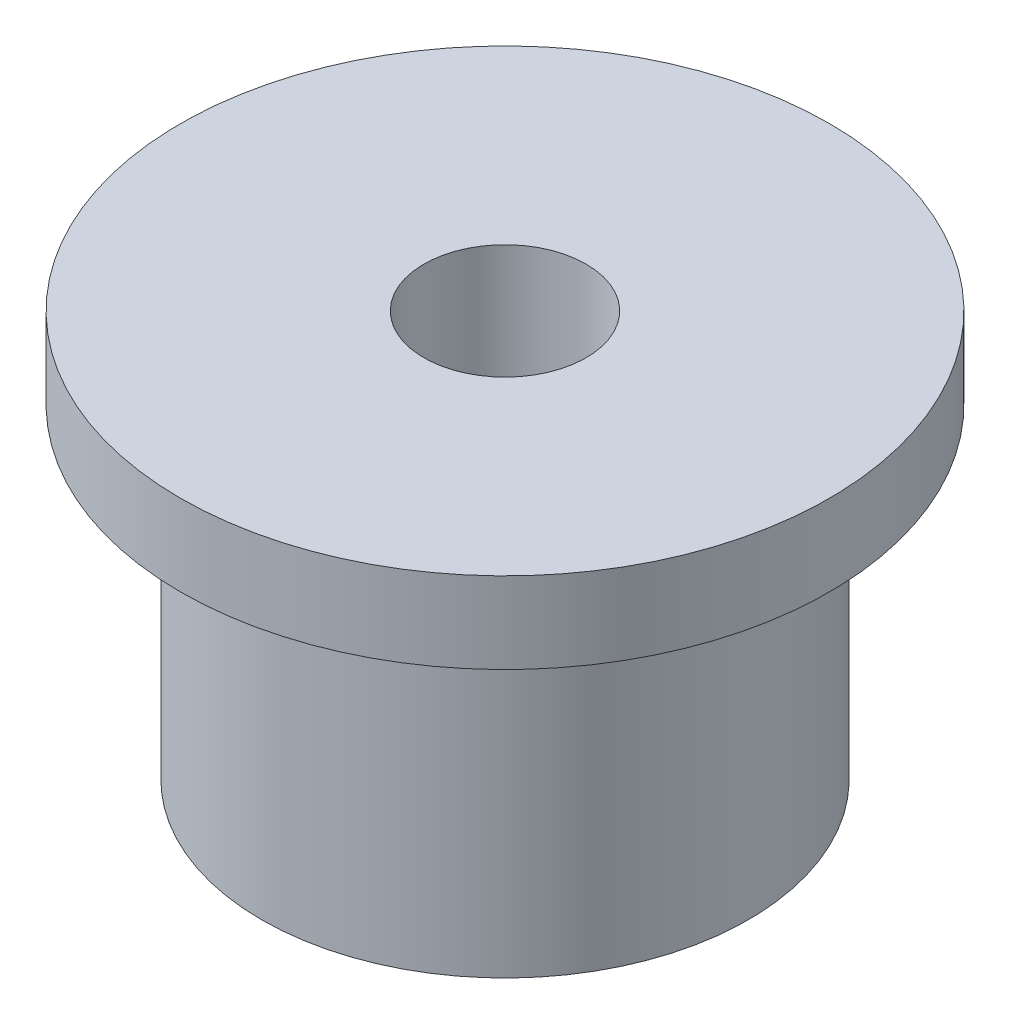
ISO-10303-21;
HEADER;
FILE_DESCRIPTION(('STEP AP214'),'2;1');
FILE_NAME('part.step','',(''),(''),'','','');
FILE_SCHEMA(('AUTOMOTIVE_DESIGN { 1 0 10303 214 1 1 1 1 }'));
ENDSEC;
DATA;
#1=APPLICATION_CONTEXT('core data for automotive mechanical design processes');
#2=APPLICATION_PROTOCOL_DEFINITION('international standard','automotive_design',2000,#1);
#3=PRODUCT_CONTEXT('',#1,'mechanical');
#4=PRODUCT('Part','Part','',(#3));
#5=PRODUCT_RELATED_PRODUCT_CATEGORY('part','',(#4));
#6=PRODUCT_DEFINITION_FORMATION('','',#4);
#7=PRODUCT_DEFINITION_CONTEXT('part definition',#1,'design');
#8=PRODUCT_DEFINITION('design','',#6,#7);
#9=PRODUCT_DEFINITION_SHAPE('','',#8);
#10=(LENGTH_UNIT() NAMED_UNIT(*) SI_UNIT(.MILLI.,.METRE.));
#11=(NAMED_UNIT(*) PLANE_ANGLE_UNIT() SI_UNIT($,.RADIAN.));
#12=(NAMED_UNIT(*) SI_UNIT($,.STERADIAN.) SOLID_ANGLE_UNIT());
#13=UNCERTAINTY_MEASURE_WITH_UNIT(LENGTH_MEASURE(1.E-05),#10,'distance_accuracy_value','');
#14=(GEOMETRIC_REPRESENTATION_CONTEXT(3) GLOBAL_UNCERTAINTY_ASSIGNED_CONTEXT((#13)) GLOBAL_UNIT_ASSIGNED_CONTEXT((#10,
#11,#12)) REPRESENTATION_CONTEXT('',''));
#15=CARTESIAN_POINT('',(0.,0.,0.));
#16=DIRECTION('',(0.,0.,1.));
#17=DIRECTION('',(1.,0.,0.));
#18=AXIS2_PLACEMENT_3D('',#15,#16,#17);
#19=CARTESIAN_POINT('',(0.,25.,0.));
#20=DIRECTION('',(0.,-1.,0.));
#21=DIRECTION('',(0.,0.,-1.));
#22=AXIS2_PLACEMENT_3D('',#19,#20,#21);
#23=CYLINDRICAL_SURFACE('',#22,100.);
#24=CARTESIAN_POINT('',(0.,25.,0.));
#25=DIRECTION('',(0.,1.,0.));
#26=DIRECTION('',(0.,0.,1.));
#27=AXIS2_PLACEMENT_3D('',#24,#25,#26);
#28=CIRCLE('',#27,100.);
#29=CARTESIAN_POINT('',(0.,25.,100.));
#30=VERTEX_POINT('',#29);
#31=EDGE_CURVE('E42',#30,#30,#28,.T.);
#32=ORIENTED_EDGE('',*,*,#31,.F.);
#33=EDGE_LOOP('',(#32));
#34=FACE_BOUND('',#33,.T.);
#35=CARTESIAN_POINT('',(0.,0.,0.));
#36=DIRECTION('',(0.,1.,0.));
#37=DIRECTION('',(0.,0.,1.));
#38=AXIS2_PLACEMENT_3D('',#35,#36,#37);
#39=CIRCLE('',#38,100.);
#40=CARTESIAN_POINT('',(0.,0.,100.));
#41=VERTEX_POINT('',#40);
#42=EDGE_CURVE('E38',#41,#41,#39,.T.);
#43=ORIENTED_EDGE('',*,*,#42,.T.);
#44=EDGE_LOOP('',(#43));
#45=FACE_BOUND('',#44,.T.);
#46=ADVANCED_FACE('F35',(#34,#45),#23,.T.);
#47=CARTESIAN_POINT('',(0.,25.,0.));
#48=DIRECTION('',(0.,1.,0.));
#49=DIRECTION('',(0.,0.,1.));
#50=AXIS2_PLACEMENT_3D('',#47,#48,#49);
#51=PLANE('',#50);
#52=CARTESIAN_POINT('',(0.,25.,0.));
#53=DIRECTION('',(0.,-1.,0.));
#54=DIRECTION('',(0.,0.,-1.));
#55=AXIS2_PLACEMENT_3D('',#52,#53,#54);
#56=CIRCLE('',#55,25.);
#57=CARTESIAN_POINT('',(0.,25.,-25.));
#58=VERTEX_POINT('',#57);
#59=EDGE_CURVE('E51',#58,#58,#56,.T.);
#60=ORIENTED_EDGE('',*,*,#59,.T.);
#61=EDGE_LOOP('',(#60));
#62=FACE_BOUND('',#61,.T.);
#63=ORIENTED_EDGE('',*,*,#31,.T.);
#64=EDGE_LOOP('',(#63));
#65=FACE_BOUND('',#64,.T.);
#66=ADVANCED_FACE('F58',(#62,#65),#51,.T.);
#67=CARTESIAN_POINT('',(0.,0.,0.));
#68=DIRECTION('',(0.,1.,0.));
#69=DIRECTION('',(0.,0.,1.));
#70=AXIS2_PLACEMENT_3D('',#67,#68,#69);
#71=PLANE('',#70);
#72=CARTESIAN_POINT('',(0.,0.,0.));
#73=DIRECTION('',(0.,-1.,0.));
#74=DIRECTION('',(0.,0.,-1.));
#75=AXIS2_PLACEMENT_3D('',#72,#73,#74);
#76=CIRCLE('',#75,75.);
#77=CARTESIAN_POINT('',(0.,0.,-75.));
#78=VERTEX_POINT('',#77);
#79=EDGE_CURVE('E10',#78,#78,#76,.T.);
#80=ORIENTED_EDGE('',*,*,#79,.F.);
#81=EDGE_LOOP('',(#80));
#82=FACE_BOUND('',#81,.T.);
#83=ORIENTED_EDGE('',*,*,#42,.F.);
#84=EDGE_LOOP('',(#83));
#85=FACE_BOUND('',#84,.T.);
#86=ADVANCED_FACE('F75',(#82,#85),#71,.F.);
#87=CARTESIAN_POINT('',(0.,-100.,0.));
#88=DIRECTION('',(0.,1.,0.));
#89=DIRECTION('',(0.,0.,1.));
#90=AXIS2_PLACEMENT_3D('',#87,#88,#89);
#91=CYLINDRICAL_SURFACE('',#90,75.);
#92=CARTESIAN_POINT('',(0.,-100.,0.));
#93=DIRECTION('',(0.,-1.,0.));
#94=DIRECTION('',(0.,0.,-1.));
#95=AXIS2_PLACEMENT_3D('',#92,#93,#94);
#96=CIRCLE('',#95,75.);
#97=CARTESIAN_POINT('',(0.,-100.,-75.));
#98=VERTEX_POINT('',#97);
#99=EDGE_CURVE('E48',#98,#98,#96,.T.);
#100=ORIENTED_EDGE('',*,*,#99,.F.);
#101=EDGE_LOOP('',(#100));
#102=FACE_BOUND('',#101,.T.);
#103=ORIENTED_EDGE('',*,*,#79,.T.);
#104=EDGE_LOOP('',(#103));
#105=FACE_BOUND('',#104,.T.);
#106=ADVANCED_FACE('F70',(#102,#105),#91,.T.);
#107=CARTESIAN_POINT('',(0.,-100.,0.));
#108=DIRECTION('',(0.,-1.,0.));
#109=DIRECTION('',(0.,0.,-1.));
#110=AXIS2_PLACEMENT_3D('',#107,#108,#109);
#111=PLANE('',#110);
#112=CARTESIAN_POINT('',(0.,-100.,0.));
#113=DIRECTION('',(0.,-1.,0.));
#114=DIRECTION('',(0.,0.,-1.));
#115=AXIS2_PLACEMENT_3D('',#112,#113,#114);
#116=CIRCLE('',#115,25.);
#117=CARTESIAN_POINT('',(0.,-100.,-25.));
#118=VERTEX_POINT('',#117);
#119=EDGE_CURVE('E52',#118,#118,#116,.T.);
#120=ORIENTED_EDGE('',*,*,#119,.F.);
#121=EDGE_LOOP('',(#120));
#122=FACE_BOUND('',#121,.T.);
#123=ORIENTED_EDGE('',*,*,#99,.T.);
#124=EDGE_LOOP('',(#123));
#125=FACE_BOUND('',#124,.T.);
#126=ADVANCED_FACE('F64',(#122,#125),#111,.T.);
#127=CARTESIAN_POINT('',(0.,25.,0.));
#128=DIRECTION('',(0.,-1.,0.));
#129=DIRECTION('',(0.,0.,-1.));
#130=AXIS2_PLACEMENT_3D('',#127,#128,#129);
#131=CYLINDRICAL_SURFACE('',#130,25.);
#132=ORIENTED_EDGE('',*,*,#59,.F.);
#133=EDGE_LOOP('',(#132));
#134=FACE_BOUND('',#133,.T.);
#135=ORIENTED_EDGE('',*,*,#119,.T.);
#136=EDGE_LOOP('',(#135));
#137=FACE_BOUND('',#136,.T.);
#138=ADVANCED_FACE('F61',(#134,#137),#131,.F.);
#139=CLOSED_SHELL('',(#46,#66,#86,#106,#126,#138));
#140=MANIFOLD_SOLID_BREP('B2',#139);
#141=ADVANCED_BREP_SHAPE_REPRESENTATION('',(#18,#140),#14);
#142=SHAPE_DEFINITION_REPRESENTATION(#9,#141);
ENDSEC;
END-ISO-10303-21;
